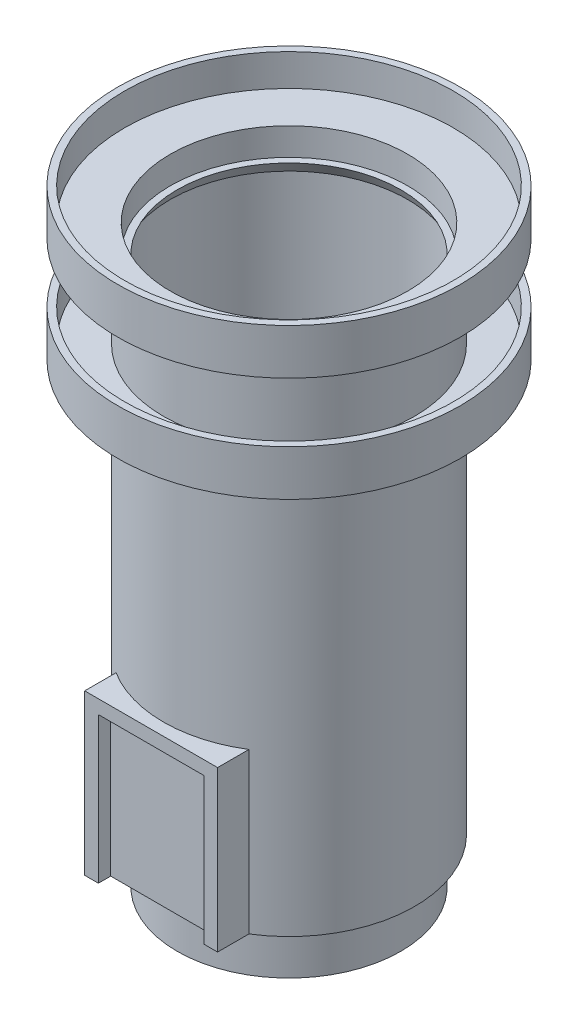
ISO-10303-21;
HEADER;
FILE_DESCRIPTION(('STEP AP214'),'2;1');
FILE_NAME('part.step','',(''),(''),'','','');
FILE_SCHEMA(('AUTOMOTIVE_DESIGN { 1 0 10303 214 1 1 1 1 }'));
ENDSEC;
DATA;
#1=APPLICATION_CONTEXT('core data for automotive mechanical design processes');
#2=APPLICATION_PROTOCOL_DEFINITION('international standard','automotive_design',2000,#1);
#3=PRODUCT_CONTEXT('',#1,'mechanical');
#4=PRODUCT('Part','Part','',(#3));
#5=PRODUCT_RELATED_PRODUCT_CATEGORY('part','',(#4));
#6=PRODUCT_DEFINITION_FORMATION('','',#4);
#7=PRODUCT_DEFINITION_CONTEXT('part definition',#1,'design');
#8=PRODUCT_DEFINITION('design','',#6,#7);
#9=PRODUCT_DEFINITION_SHAPE('','',#8);
#10=(LENGTH_UNIT() NAMED_UNIT(*) SI_UNIT(.MILLI.,.METRE.));
#11=(NAMED_UNIT(*) PLANE_ANGLE_UNIT() SI_UNIT($,.RADIAN.));
#12=(NAMED_UNIT(*) SI_UNIT($,.STERADIAN.) SOLID_ANGLE_UNIT());
#13=UNCERTAINTY_MEASURE_WITH_UNIT(LENGTH_MEASURE(1.E-05),#10,'distance_accuracy_value','');
#14=(GEOMETRIC_REPRESENTATION_CONTEXT(3) GLOBAL_UNCERTAINTY_ASSIGNED_CONTEXT((#13)) GLOBAL_UNIT_ASSIGNED_CONTEXT((#10,
#11,#12)) REPRESENTATION_CONTEXT('',''));
#15=CARTESIAN_POINT('',(0.,0.,0.));
#16=DIRECTION('',(0.,0.,1.));
#17=DIRECTION('',(1.,0.,0.));
#18=AXIS2_PLACEMENT_3D('',#15,#16,#17);
#19=CARTESIAN_POINT('',(-40.7129955139234,3.51989743721269,0.));
#20=DIRECTION('',(0.,-1.,0.));
#21=DIRECTION('',(1.,0.,0.));
#22=AXIS2_PLACEMENT_3D('',#19,#20,#21);
#23=PLANE('',#22);
#24=CARTESIAN_POINT('',(-17.7129955139234,3.51989743721269,0.));
#25=DIRECTION('',(0.,1.,0.));
#26=DIRECTION('',(-1.,0.,0.));
#27=AXIS2_PLACEMENT_3D('',#24,#25,#26);
#28=CIRCLE('',#27,23.);
#29=CARTESIAN_POINT('',(-40.7129955139234,3.51989743721269,0.));
#30=VERTEX_POINT('',#29);
#31=EDGE_CURVE('E158',#30,#30,#28,.T.);
#32=ORIENTED_EDGE('',*,*,#31,.T.);
#33=EDGE_LOOP('',(#32));
#34=FACE_BOUND('',#33,.T.);
#35=CARTESIAN_POINT('',(-17.7129955139234,3.51989743721269,0.));
#36=DIRECTION('',(0.,1.,0.));
#37=DIRECTION('',(-1.,0.,0.));
#38=AXIS2_PLACEMENT_3D('',#35,#36,#37);
#39=CIRCLE('',#38,24.5);
#40=CARTESIAN_POINT('',(-42.2129955139234,3.51989743721269,0.));
#41=VERTEX_POINT('',#40);
#42=EDGE_CURVE('E11',#41,#41,#39,.T.);
#43=ORIENTED_EDGE('',*,*,#42,.F.);
#44=EDGE_LOOP('',(#43));
#45=FACE_BOUND('',#44,.T.);
#46=ADVANCED_FACE('F33',(#34,#45),#23,.T.);
#47=CARTESIAN_POINT('',(-17.7129955139234,104.262295081967,0.));
#48=DIRECTION('',(0.,1.,0.));
#49=DIRECTION('',(-1.,0.,0.));
#50=AXIS2_PLACEMENT_3D('',#47,#48,#49);
#51=CYLINDRICAL_SURFACE('',#50,24.5);
#52=ORIENTED_EDGE('',*,*,#42,.T.);
#53=EDGE_LOOP('',(#52));
#54=FACE_BOUND('',#53,.T.);
#55=CARTESIAN_POINT('',(-17.7129955139234,13.5198974372127,0.));
#56=DIRECTION('',(0.,1.,0.));
#57=DIRECTION('',(-1.,0.,0.));
#58=AXIS2_PLACEMENT_3D('',#55,#56,#57);
#59=CIRCLE('',#58,24.5);
#60=CARTESIAN_POINT('',(-42.2129955139234,13.5198974372127,0.));
#61=VERTEX_POINT('',#60);
#62=EDGE_CURVE('E40',#61,#61,#59,.T.);
#63=ORIENTED_EDGE('',*,*,#62,.F.);
#64=EDGE_LOOP('',(#63));
#65=FACE_BOUND('',#64,.T.);
#66=ADVANCED_FACE('F223',(#54,#65),#51,.T.);
#67=CARTESIAN_POINT('',(-42.2129955139234,13.5198974372127,0.));
#68=DIRECTION('',(0.,-1.,0.));
#69=DIRECTION('',(1.,0.,0.));
#70=AXIS2_PLACEMENT_3D('',#67,#68,#69);
#71=PLANE('',#70);
#72=DIRECTION('',(0.,0.,1.));
#73=VECTOR('',#72,1.);
#74=CARTESIAN_POINT('',(-29.267838598035,13.5198974372127,27.502521141036));
#75=LINE('',#74,#73);
#76=CARTESIAN_POINT('',(-29.267838598035,13.5198974372127,27.502521141036));
#77=VERTEX_POINT('',#76);
#78=CARTESIAN_POINT('',(-29.267838598035,13.5198974372127,30.202521141036));
#79=VERTEX_POINT('',#78);
#80=EDGE_CURVE('E98',#77,#79,#75,.T.);
#81=ORIENTED_EDGE('',*,*,#80,.T.);
#82=DIRECTION('',(-1.,0.,0.));
#83=VECTOR('',#82,1.);
#84=CARTESIAN_POINT('',(-32.267838598035,13.5198974372127,30.202521141036));
#85=LINE('',#84,#83);
#86=CARTESIAN_POINT('',(-32.267838598035,13.5198974372127,30.202521141036));
#87=VERTEX_POINT('',#86);
#88=EDGE_CURVE('E152',#79,#87,#85,.T.);
#89=ORIENTED_EDGE('',*,*,#88,.T.);
#90=DIRECTION('',(0.,0.,-1.));
#91=VECTOR('',#90,1.);
#92=CARTESIAN_POINT('',(-32.267838598035,13.5198974372127,23.332521141036));
#93=LINE('',#92,#91);
#94=CARTESIAN_POINT('',(-32.267838598035,13.5198974372127,23.332521141036));
#95=VERTEX_POINT('',#94);
#96=EDGE_CURVE('E140',#87,#95,#93,.T.);
#97=ORIENTED_EDGE('',*,*,#96,.T.);
#98=CARTESIAN_POINT('',(-17.7129955139234,13.5198974372127,0.));
#99=DIRECTION('',(0.,1.,0.));
#100=DIRECTION('',(-1.,0.,0.));
#101=AXIS2_PLACEMENT_3D('',#98,#99,#100);
#102=CIRCLE('',#101,27.5000000000001);
#103=CARTESIAN_POINT('',(-3.15815242981178,13.5198974372127,23.332521141036));
#104=VERTEX_POINT('',#103);
#105=EDGE_CURVE('E219',#104,#95,#102,.T.);
#106=ORIENTED_EDGE('',*,*,#105,.F.);
#107=DIRECTION('',(0.,0.,1.));
#108=VECTOR('',#107,1.);
#109=CARTESIAN_POINT('',(-3.15815242981178,13.5198974372127,23.332521141036));
#110=LINE('',#109,#108);
#111=CARTESIAN_POINT('',(-3.15815242981178,13.5198974372127,30.202521141036));
#112=VERTEX_POINT('',#111);
#113=EDGE_CURVE('E133',#104,#112,#110,.T.);
#114=ORIENTED_EDGE('',*,*,#113,.T.);
#115=CARTESIAN_POINT('',(-6.15815242981178,13.5198974372127,30.202521141036));
#116=VERTEX_POINT('',#115);
#117=EDGE_CURVE('E153',#112,#116,#85,.T.);
#118=ORIENTED_EDGE('',*,*,#117,.T.);
#119=DIRECTION('',(0.,0.,1.));
#120=VECTOR('',#119,1.);
#121=CARTESIAN_POINT('',(-6.15815242981178,13.5198974372127,27.502521141036));
#122=LINE('',#121,#120);
#123=CARTESIAN_POINT('',(-6.15815242981178,13.5198974372127,27.502521141036));
#124=VERTEX_POINT('',#123);
#125=EDGE_CURVE('E47',#124,#116,#122,.T.);
#126=ORIENTED_EDGE('',*,*,#125,.F.);
#127=DIRECTION('',(1.,0.,0.));
#128=VECTOR('',#127,1.);
#129=CARTESIAN_POINT('',(-29.267838598035,13.5198974372127,27.502521141036));
#130=LINE('',#129,#128);
#131=EDGE_CURVE('E114',#77,#124,#130,.T.);
#132=ORIENTED_EDGE('',*,*,#131,.F.);
#133=EDGE_LOOP('',(#81,#89,#97,#106,#114,#118,#126,#132));
#134=FACE_BOUND('',#133,.T.);
#135=ORIENTED_EDGE('',*,*,#62,.T.);
#136=EDGE_LOOP('',(#135));
#137=FACE_BOUND('',#136,.T.);
#138=ADVANCED_FACE('F118',(#134,#137),#71,.T.);
#139=CARTESIAN_POINT('',(-17.7129955139234,104.262295081967,0.));
#140=DIRECTION('',(0.,1.,0.));
#141=DIRECTION('',(-1.,0.,0.));
#142=AXIS2_PLACEMENT_3D('',#139,#140,#141);
#143=CYLINDRICAL_SURFACE('',#142,27.5000000000001);
#144=DIRECTION('',(0.,-1.,0.));
#145=VECTOR('',#144,1.);
#146=CARTESIAN_POINT('',(-32.267838598035,48.5198974372127,23.332521141036));
#147=LINE('',#146,#145);
#148=CARTESIAN_POINT('',(-32.267838598035,48.5198974372127,23.332521141036));
#149=VERTEX_POINT('',#148);
#150=EDGE_CURVE('E55',#149,#95,#147,.T.);
#151=ORIENTED_EDGE('',*,*,#150,.F.);
#152=CARTESIAN_POINT('',(-17.7129955139234,48.5198974372127,0.));
#153=DIRECTION('',(0.,1.,0.));
#154=DIRECTION('',(-1.,0.,0.));
#155=AXIS2_PLACEMENT_3D('',#152,#153,#154);
#156=CIRCLE('',#155,27.5);
#157=CARTESIAN_POINT('',(-3.15815242981179,48.5198974372127,23.332521141036));
#158=VERTEX_POINT('',#157);
#159=EDGE_CURVE('E137',#149,#158,#156,.T.);
#160=ORIENTED_EDGE('',*,*,#159,.T.);
#161=DIRECTION('',(0.,-1.,0.));
#162=VECTOR('',#161,1.);
#163=CARTESIAN_POINT('',(-3.15815242981179,48.5198974372127,23.332521141036));
#164=LINE('',#163,#162);
#165=EDGE_CURVE('E149',#158,#104,#164,.T.);
#166=ORIENTED_EDGE('',*,*,#165,.T.);
#167=ORIENTED_EDGE('',*,*,#105,.T.);
#168=EDGE_LOOP('',(#151,#160,#166,#167));
#169=FACE_BOUND('',#168,.T.);
#170=CARTESIAN_POINT('',(-17.7129955139234,100.519897437213,0.));
#171=DIRECTION('',(0.,1.,0.));
#172=DIRECTION('',(-1.,0.,0.));
#173=AXIS2_PLACEMENT_3D('',#170,#171,#172);
#174=CIRCLE('',#173,27.5000000000001);
#175=CARTESIAN_POINT('',(-45.2129955139235,100.519897437213,0.));
#176=VERTEX_POINT('',#175);
#177=EDGE_CURVE('E216',#176,#176,#174,.T.);
#178=ORIENTED_EDGE('',*,*,#177,.F.);
#179=EDGE_LOOP('',(#178));
#180=FACE_BOUND('',#179,.T.);
#181=ADVANCED_FACE('F230',(#169,#180),#143,.T.);
#182=CARTESIAN_POINT('',(-17.7129955139234,103.519897437213,0.));
#183=DIRECTION('',(0.,1.,0.));
#184=DIRECTION('',(-1.,0.,0.));
#185=AXIS2_PLACEMENT_3D('',#182,#183,#184);
#186=CONICAL_SURFACE('',#185,37.5000000000001,1.27933953231703);
#187=ORIENTED_EDGE('',*,*,#177,.T.);
#188=EDGE_LOOP('',(#187));
#189=FACE_BOUND('',#188,.T.);
#190=CARTESIAN_POINT('',(-17.7129955139234,103.519897437213,0.));
#191=DIRECTION('',(0.,1.,0.));
#192=DIRECTION('',(-1.,0.,0.));
#193=AXIS2_PLACEMENT_3D('',#190,#191,#192);
#194=CIRCLE('',#193,37.5000000000001);
#195=CARTESIAN_POINT('',(-55.2129955139235,103.519897437213,0.));
#196=VERTEX_POINT('',#195);
#197=EDGE_CURVE('E213',#196,#196,#194,.T.);
#198=ORIENTED_EDGE('',*,*,#197,.F.);
#199=EDGE_LOOP('',(#198));
#200=FACE_BOUND('',#199,.T.);
#201=ADVANCED_FACE('F236',(#189,#200),#186,.T.);
#202=CARTESIAN_POINT('',(-17.7129955139234,104.262295081967,0.));
#203=DIRECTION('',(0.,1.,0.));
#204=DIRECTION('',(-1.,0.,0.));
#205=AXIS2_PLACEMENT_3D('',#202,#203,#204);
#206=CYLINDRICAL_SURFACE('',#205,37.5000000000001);
#207=ORIENTED_EDGE('',*,*,#197,.T.);
#208=EDGE_LOOP('',(#207));
#209=FACE_BOUND('',#208,.T.);
#210=CARTESIAN_POINT('',(-17.7129955139234,113.519897437213,0.));
#211=DIRECTION('',(0.,1.,0.));
#212=DIRECTION('',(-1.,0.,0.));
#213=AXIS2_PLACEMENT_3D('',#210,#211,#212);
#214=CIRCLE('',#213,37.5000000000001);
#215=CARTESIAN_POINT('',(-55.2129955139235,113.519897437213,0.));
#216=VERTEX_POINT('',#215);
#217=EDGE_CURVE('E210',#216,#216,#214,.T.);
#218=ORIENTED_EDGE('',*,*,#217,.F.);
#219=EDGE_LOOP('',(#218));
#220=FACE_BOUND('',#219,.T.);
#221=ADVANCED_FACE('F239',(#209,#220),#206,.T.);
#222=CARTESIAN_POINT('',(-55.2129955139235,113.519897437213,0.));
#223=DIRECTION('',(0.,1.,0.));
#224=DIRECTION('',(-1.,0.,0.));
#225=AXIS2_PLACEMENT_3D('',#222,#223,#224);
#226=PLANE('',#225);
#227=ORIENTED_EDGE('',*,*,#217,.T.);
#228=EDGE_LOOP('',(#227));
#229=FACE_BOUND('',#228,.T.);
#230=CARTESIAN_POINT('',(-17.7129955139234,113.519897437213,0.));
#231=DIRECTION('',(0.,1.,0.));
#232=DIRECTION('',(-1.,0.,0.));
#233=AXIS2_PLACEMENT_3D('',#230,#231,#232);
#234=CIRCLE('',#233,36.0000000000001);
#235=CARTESIAN_POINT('',(-53.7129955139235,113.519897437213,0.));
#236=VERTEX_POINT('',#235);
#237=EDGE_CURVE('E207',#236,#236,#234,.T.);
#238=ORIENTED_EDGE('',*,*,#237,.F.);
#239=EDGE_LOOP('',(#238));
#240=FACE_BOUND('',#239,.T.);
#241=ADVANCED_FACE('F243',(#229,#240),#226,.T.);
#242=CARTESIAN_POINT('',(-17.7129955139234,104.262295081967,0.));
#243=DIRECTION('',(0.,1.,0.));
#244=DIRECTION('',(-1.,0.,0.));
#245=AXIS2_PLACEMENT_3D('',#242,#243,#244);
#246=CYLINDRICAL_SURFACE('',#245,36.0000000000001);
#247=ORIENTED_EDGE('',*,*,#237,.T.);
#248=EDGE_LOOP('',(#247));
#249=FACE_BOUND('',#248,.T.);
#250=CARTESIAN_POINT('',(-17.7129955139234,106.519897437213,0.));
#251=DIRECTION('',(0.,1.,0.));
#252=DIRECTION('',(-1.,0.,0.));
#253=AXIS2_PLACEMENT_3D('',#250,#251,#252);
#254=CIRCLE('',#253,36.0000000000001);
#255=CARTESIAN_POINT('',(-53.7129955139235,106.519897437213,0.));
#256=VERTEX_POINT('',#255);
#257=EDGE_CURVE('E204',#256,#256,#254,.T.);
#258=ORIENTED_EDGE('',*,*,#257,.F.);
#259=EDGE_LOOP('',(#258));
#260=FACE_BOUND('',#259,.T.);
#261=ADVANCED_FACE('F247',(#249,#260),#246,.F.);
#262=CARTESIAN_POINT('',(-53.7129955139235,106.519897437213,0.));
#263=DIRECTION('',(0.,1.,0.));
#264=DIRECTION('',(-1.,0.,0.));
#265=AXIS2_PLACEMENT_3D('',#262,#263,#264);
#266=PLANE('',#265);
#267=ORIENTED_EDGE('',*,*,#257,.T.);
#268=EDGE_LOOP('',(#267));
#269=FACE_BOUND('',#268,.T.);
#270=CARTESIAN_POINT('',(-17.7129955139234,106.519897437213,0.));
#271=DIRECTION('',(0.,1.,0.));
#272=DIRECTION('',(-1.,0.,0.));
#273=AXIS2_PLACEMENT_3D('',#270,#271,#272);
#274=CIRCLE('',#273,27.5000000000001);
#275=CARTESIAN_POINT('',(-45.2129955139235,106.519897437213,0.));
#276=VERTEX_POINT('',#275);
#277=EDGE_CURVE('E201',#276,#276,#274,.T.);
#278=ORIENTED_EDGE('',*,*,#277,.F.);
#279=EDGE_LOOP('',(#278));
#280=FACE_BOUND('',#279,.T.);
#281=ADVANCED_FACE('F251',(#269,#280),#266,.T.);
#282=CARTESIAN_POINT('',(-17.7129955139234,104.262295081967,0.));
#283=DIRECTION('',(0.,1.,0.));
#284=DIRECTION('',(-1.,0.,0.));
#285=AXIS2_PLACEMENT_3D('',#282,#283,#284);
#286=CYLINDRICAL_SURFACE('',#285,27.5000000000001);
#287=ORIENTED_EDGE('',*,*,#277,.T.);
#288=EDGE_LOOP('',(#287));
#289=FACE_BOUND('',#288,.T.);
#290=CARTESIAN_POINT('',(-17.7129955139234,123.519897437213,0.));
#291=DIRECTION('',(0.,1.,0.));
#292=DIRECTION('',(-1.,0.,0.));
#293=AXIS2_PLACEMENT_3D('',#290,#291,#292);
#294=CIRCLE('',#293,27.5000000000001);
#295=CARTESIAN_POINT('',(-45.2129955139235,123.519897437213,0.));
#296=VERTEX_POINT('',#295);
#297=EDGE_CURVE('E198',#296,#296,#294,.T.);
#298=ORIENTED_EDGE('',*,*,#297,.F.);
#299=EDGE_LOOP('',(#298));
#300=FACE_BOUND('',#299,.T.);
#301=ADVANCED_FACE('F255',(#289,#300),#286,.T.);
#302=CARTESIAN_POINT('',(-17.7129955139234,126.519897437213,0.));
#303=DIRECTION('',(0.,1.,0.));
#304=DIRECTION('',(-1.,0.,0.));
#305=AXIS2_PLACEMENT_3D('',#302,#303,#304);
#306=CONICAL_SURFACE('',#305,37.5000000000001,1.27933953231703);
#307=ORIENTED_EDGE('',*,*,#297,.T.);
#308=EDGE_LOOP('',(#307));
#309=FACE_BOUND('',#308,.T.);
#310=CARTESIAN_POINT('',(-17.7129955139234,126.519897437213,0.));
#311=DIRECTION('',(0.,1.,0.));
#312=DIRECTION('',(-1.,0.,0.));
#313=AXIS2_PLACEMENT_3D('',#310,#311,#312);
#314=CIRCLE('',#313,37.5000000000001);
#315=CARTESIAN_POINT('',(-55.2129955139235,126.519897437213,0.));
#316=VERTEX_POINT('',#315);
#317=EDGE_CURVE('E195',#316,#316,#314,.T.);
#318=ORIENTED_EDGE('',*,*,#317,.F.);
#319=EDGE_LOOP('',(#318));
#320=FACE_BOUND('',#319,.T.);
#321=ADVANCED_FACE('F259',(#309,#320),#306,.T.);
#322=CARTESIAN_POINT('',(-17.7129955139234,104.262295081967,0.));
#323=DIRECTION('',(0.,1.,0.));
#324=DIRECTION('',(-1.,0.,0.));
#325=AXIS2_PLACEMENT_3D('',#322,#323,#324);
#326=CYLINDRICAL_SURFACE('',#325,37.5000000000001);
#327=ORIENTED_EDGE('',*,*,#317,.T.);
#328=EDGE_LOOP('',(#327));
#329=FACE_BOUND('',#328,.T.);
#330=CARTESIAN_POINT('',(-17.7129955139234,136.519897437213,0.));
#331=DIRECTION('',(0.,1.,0.));
#332=DIRECTION('',(-1.,0.,0.));
#333=AXIS2_PLACEMENT_3D('',#330,#331,#332);
#334=CIRCLE('',#333,37.5000000000001);
#335=CARTESIAN_POINT('',(-55.2129955139235,136.519897437213,0.));
#336=VERTEX_POINT('',#335);
#337=EDGE_CURVE('E192',#336,#336,#334,.T.);
#338=ORIENTED_EDGE('',*,*,#337,.F.);
#339=EDGE_LOOP('',(#338));
#340=FACE_BOUND('',#339,.T.);
#341=ADVANCED_FACE('F263',(#329,#340),#326,.T.);
#342=CARTESIAN_POINT('',(-55.2129955139235,136.519897437213,0.));
#343=DIRECTION('',(0.,1.,0.));
#344=DIRECTION('',(-1.,0.,0.));
#345=AXIS2_PLACEMENT_3D('',#342,#343,#344);
#346=PLANE('',#345);
#347=ORIENTED_EDGE('',*,*,#337,.T.);
#348=EDGE_LOOP('',(#347));
#349=FACE_BOUND('',#348,.T.);
#350=CARTESIAN_POINT('',(-17.7129955139234,136.519897437213,0.));
#351=DIRECTION('',(0.,1.,0.));
#352=DIRECTION('',(-1.,0.,0.));
#353=AXIS2_PLACEMENT_3D('',#350,#351,#352);
#354=CIRCLE('',#353,36.);
#355=CARTESIAN_POINT('',(-53.7129955139235,136.519897437213,0.));
#356=VERTEX_POINT('',#355);
#357=EDGE_CURVE('E189',#356,#356,#354,.T.);
#358=ORIENTED_EDGE('',*,*,#357,.F.);
#359=EDGE_LOOP('',(#358));
#360=FACE_BOUND('',#359,.T.);
#361=ADVANCED_FACE('F267',(#349,#360),#346,.T.);
#362=CARTESIAN_POINT('',(-17.7129955139234,104.262295081967,0.));
#363=DIRECTION('',(0.,1.,0.));
#364=DIRECTION('',(-1.,0.,0.));
#365=AXIS2_PLACEMENT_3D('',#362,#363,#364);
#366=CYLINDRICAL_SURFACE('',#365,36.0000000000001);
#367=ORIENTED_EDGE('',*,*,#357,.T.);
#368=EDGE_LOOP('',(#367));
#369=FACE_BOUND('',#368,.T.);
#370=CARTESIAN_POINT('',(-17.7129955139234,129.519897437213,0.));
#371=DIRECTION('',(0.,1.,0.));
#372=DIRECTION('',(-1.,0.,0.));
#373=AXIS2_PLACEMENT_3D('',#370,#371,#372);
#374=CIRCLE('',#373,36.0000000000001);
#375=CARTESIAN_POINT('',(-53.7129955139235,129.519897437213,0.));
#376=VERTEX_POINT('',#375);
#377=EDGE_CURVE('E186',#376,#376,#374,.T.);
#378=ORIENTED_EDGE('',*,*,#377,.F.);
#379=EDGE_LOOP('',(#378));
#380=FACE_BOUND('',#379,.T.);
#381=ADVANCED_FACE('F271',(#369,#380),#366,.F.);
#382=CARTESIAN_POINT('',(-53.7129955139235,129.519897437213,0.));
#383=DIRECTION('',(0.,1.,0.));
#384=DIRECTION('',(-1.,0.,0.));
#385=AXIS2_PLACEMENT_3D('',#382,#383,#384);
#386=PLANE('',#385);
#387=ORIENTED_EDGE('',*,*,#377,.T.);
#388=EDGE_LOOP('',(#387));
#389=FACE_BOUND('',#388,.T.);
#390=CARTESIAN_POINT('',(-17.7129955139234,129.519897437213,0.));
#391=DIRECTION('',(0.,1.,0.));
#392=DIRECTION('',(-1.,0.,0.));
#393=AXIS2_PLACEMENT_3D('',#390,#391,#392);
#394=CIRCLE('',#393,26.);
#395=CARTESIAN_POINT('',(-43.7129955139235,129.519897437213,0.));
#396=VERTEX_POINT('',#395);
#397=EDGE_CURVE('E183',#396,#396,#394,.T.);
#398=ORIENTED_EDGE('',*,*,#397,.F.);
#399=EDGE_LOOP('',(#398));
#400=FACE_BOUND('',#399,.T.);
#401=ADVANCED_FACE('F275',(#389,#400),#386,.T.);
#402=CARTESIAN_POINT('',(-17.7129955139234,104.262295081967,0.));
#403=DIRECTION('',(0.,1.,0.));
#404=DIRECTION('',(-1.,0.,0.));
#405=AXIS2_PLACEMENT_3D('',#402,#403,#404);
#406=CYLINDRICAL_SURFACE('',#405,26.);
#407=ORIENTED_EDGE('',*,*,#397,.T.);
#408=EDGE_LOOP('',(#407));
#409=FACE_BOUND('',#408,.T.);
#410=CARTESIAN_POINT('',(-17.7129955139234,123.519897437213,0.));
#411=DIRECTION('',(0.,1.,0.));
#412=DIRECTION('',(-1.,0.,0.));
#413=AXIS2_PLACEMENT_3D('',#410,#411,#412);
#414=CIRCLE('',#413,26.);
#415=CARTESIAN_POINT('',(-43.7129955139235,123.519897437213,0.));
#416=VERTEX_POINT('',#415);
#417=EDGE_CURVE('E180',#416,#416,#414,.T.);
#418=ORIENTED_EDGE('',*,*,#417,.F.);
#419=EDGE_LOOP('',(#418));
#420=FACE_BOUND('',#419,.T.);
#421=ADVANCED_FACE('F279',(#409,#420),#406,.F.);
#422=CARTESIAN_POINT('',(-43.7129955139235,123.519897437213,0.));
#423=DIRECTION('',(0.,1.,0.));
#424=DIRECTION('',(-1.,0.,0.));
#425=AXIS2_PLACEMENT_3D('',#422,#423,#424);
#426=PLANE('',#425);
#427=ORIENTED_EDGE('',*,*,#417,.T.);
#428=EDGE_LOOP('',(#427));
#429=FACE_BOUND('',#428,.T.);
#430=CARTESIAN_POINT('',(-17.7129955139234,123.519897437213,0.));
#431=DIRECTION('',(0.,1.,0.));
#432=DIRECTION('',(-1.,0.,0.));
#433=AXIS2_PLACEMENT_3D('',#430,#431,#432);
#434=CIRCLE('',#433,24.5);
#435=CARTESIAN_POINT('',(-42.2129955139234,123.519897437213,0.));
#436=VERTEX_POINT('',#435);
#437=EDGE_CURVE('E177',#436,#436,#434,.T.);
#438=ORIENTED_EDGE('',*,*,#437,.F.);
#439=EDGE_LOOP('',(#438));
#440=FACE_BOUND('',#439,.T.);
#441=ADVANCED_FACE('F283',(#429,#440),#426,.T.);
#442=CARTESIAN_POINT('',(-17.7129955139234,120.917625561823,0.));
#443=DIRECTION('',(0.,-1.,0.));
#444=DIRECTION('',(1.,0.,0.));
#445=AXIS2_PLACEMENT_3D('',#442,#443,#444);
#446=CONICAL_SURFACE('',#445,26.0000000000001,0.522900344301376);
#447=ORIENTED_EDGE('',*,*,#437,.T.);
#448=EDGE_LOOP('',(#447));
#449=FACE_BOUND('',#448,.T.);
#450=CARTESIAN_POINT('',(-17.7129955139234,120.917625561823,0.));
#451=DIRECTION('',(0.,1.,0.));
#452=DIRECTION('',(-1.,0.,0.));
#453=AXIS2_PLACEMENT_3D('',#450,#451,#452);
#454=CIRCLE('',#453,26.0000000000001);
#455=CARTESIAN_POINT('',(-43.7129955139235,120.917625561823,0.));
#456=VERTEX_POINT('',#455);
#457=EDGE_CURVE('E174',#456,#456,#454,.T.);
#458=ORIENTED_EDGE('',*,*,#457,.F.);
#459=EDGE_LOOP('',(#458));
#460=FACE_BOUND('',#459,.T.);
#461=ADVANCED_FACE('F287',(#449,#460),#446,.F.);
#462=CARTESIAN_POINT('',(-17.7129955139234,104.262295081967,0.));
#463=DIRECTION('',(0.,1.,0.));
#464=DIRECTION('',(-1.,0.,0.));
#465=AXIS2_PLACEMENT_3D('',#462,#463,#464);
#466=CYLINDRICAL_SURFACE('',#465,26.0000000000001);
#467=ORIENTED_EDGE('',*,*,#457,.T.);
#468=EDGE_LOOP('',(#467));
#469=FACE_BOUND('',#468,.T.);
#470=CARTESIAN_POINT('',(-17.7129955139234,16.5198974372127,0.));
#471=DIRECTION('',(0.,1.,0.));
#472=DIRECTION('',(-1.,0.,0.));
#473=AXIS2_PLACEMENT_3D('',#470,#471,#472);
#474=CIRCLE('',#473,26.0000000000001);
#475=CARTESIAN_POINT('',(-43.7129955139235,16.5198974372127,0.));
#476=VERTEX_POINT('',#475);
#477=EDGE_CURVE('E171',#476,#476,#474,.T.);
#478=ORIENTED_EDGE('',*,*,#477,.F.);
#479=EDGE_LOOP('',(#478));
#480=FACE_BOUND('',#479,.T.);
#481=ADVANCED_FACE('F291',(#469,#480),#466,.F.);
#482=CARTESIAN_POINT('',(-40.7129955139234,16.5198974372127,0.));
#483=DIRECTION('',(0.,1.,0.));
#484=DIRECTION('',(-1.,0.,0.));
#485=AXIS2_PLACEMENT_3D('',#482,#483,#484);
#486=PLANE('',#485);
#487=ORIENTED_EDGE('',*,*,#477,.T.);
#488=EDGE_LOOP('',(#487));
#489=FACE_BOUND('',#488,.T.);
#490=CARTESIAN_POINT('',(-17.7129955139234,16.5198974372127,0.));
#491=DIRECTION('',(0.,1.,0.));
#492=DIRECTION('',(-1.,0.,0.));
#493=AXIS2_PLACEMENT_3D('',#490,#491,#492);
#494=CIRCLE('',#493,23.);
#495=CARTESIAN_POINT('',(-40.7129955139234,16.5198974372127,0.));
#496=VERTEX_POINT('',#495);
#497=EDGE_CURVE('E168',#496,#496,#494,.T.);
#498=ORIENTED_EDGE('',*,*,#497,.F.);
#499=EDGE_LOOP('',(#498));
#500=FACE_BOUND('',#499,.T.);
#501=ADVANCED_FACE('F295',(#489,#500),#486,.T.);
#502=CARTESIAN_POINT('',(-17.7129955139234,104.262295081967,0.));
#503=DIRECTION('',(0.,1.,0.));
#504=DIRECTION('',(-1.,0.,0.));
#505=AXIS2_PLACEMENT_3D('',#502,#503,#504);
#506=CYLINDRICAL_SURFACE('',#505,23.);
#507=ORIENTED_EDGE('',*,*,#497,.T.);
#508=EDGE_LOOP('',(#507));
#509=FACE_BOUND('',#508,.T.);
#510=ORIENTED_EDGE('',*,*,#31,.F.);
#511=EDGE_LOOP('',(#510));
#512=FACE_BOUND('',#511,.T.);
#513=ADVANCED_FACE('F299',(#509,#512),#506,.F.);
#514=CARTESIAN_POINT('',(-32.267838598035,48.5198974372127,23.332521141036));
#515=DIRECTION('',(-1.,0.,0.));
#516=DIRECTION('',(0.,-1.,0.));
#517=AXIS2_PLACEMENT_3D('',#514,#515,#516);
#518=PLANE('',#517);
#519=ORIENTED_EDGE('',*,*,#96,.F.);
#520=DIRECTION('',(0.,-1.,0.));
#521=VECTOR('',#520,1.);
#522=CARTESIAN_POINT('',(-32.267838598035,48.5198974372127,30.202521141036));
#523=LINE('',#522,#521);
#524=CARTESIAN_POINT('',(-32.267838598035,48.5198974372127,30.202521141036));
#525=VERTEX_POINT('',#524);
#526=EDGE_CURVE('E159',#525,#87,#523,.T.);
#527=ORIENTED_EDGE('',*,*,#526,.F.);
#528=DIRECTION('',(0.,0.,-1.));
#529=VECTOR('',#528,1.);
#530=CARTESIAN_POINT('',(-32.267838598035,48.5198974372127,23.332521141036));
#531=LINE('',#530,#529);
#532=EDGE_CURVE('E146',#525,#149,#531,.T.);
#533=ORIENTED_EDGE('',*,*,#532,.T.);
#534=ORIENTED_EDGE('',*,*,#150,.T.);
#535=EDGE_LOOP('',(#519,#527,#533,#534));
#536=FACE_BOUND('',#535,.T.);
#537=ADVANCED_FACE('F303',(#536),#518,.T.);
#538=CARTESIAN_POINT('',(-32.267838598035,48.5198974372127,30.202521141036));
#539=DIRECTION('',(0.,0.,1.));
#540=DIRECTION('',(1.,0.,0.));
#541=AXIS2_PLACEMENT_3D('',#538,#539,#540);
#542=PLANE('',#541);
#543=DIRECTION('',(0.,-1.,0.));
#544=VECTOR('',#543,1.);
#545=CARTESIAN_POINT('',(-29.267838598035,13.5198974372127,30.202521141036));
#546=LINE('',#545,#544);
#547=CARTESIAN_POINT('',(-29.267838598035,45.5198974372127,30.202521141036));
#548=VERTEX_POINT('',#547);
#549=EDGE_CURVE('E104',#548,#79,#546,.T.);
#550=ORIENTED_EDGE('',*,*,#549,.F.);
#551=DIRECTION('',(-1.,0.,0.));
#552=VECTOR('',#551,1.);
#553=CARTESIAN_POINT('',(-29.267838598035,45.5198974372127,30.202521141036));
#554=LINE('',#553,#552);
#555=CARTESIAN_POINT('',(-6.15815242981178,45.5198974372127,30.202521141036));
#556=VERTEX_POINT('',#555);
#557=EDGE_CURVE('E116',#556,#548,#554,.T.);
#558=ORIENTED_EDGE('',*,*,#557,.F.);
#559=DIRECTION('',(0.,1.,0.));
#560=VECTOR('',#559,1.);
#561=CARTESIAN_POINT('',(-6.15815242981178,13.5198974372127,30.202521141036));
#562=LINE('',#561,#560);
#563=EDGE_CURVE('E127',#116,#556,#562,.T.);
#564=ORIENTED_EDGE('',*,*,#563,.F.);
#565=ORIENTED_EDGE('',*,*,#117,.F.);
#566=DIRECTION('',(0.,-1.,0.));
#567=VECTOR('',#566,1.);
#568=CARTESIAN_POINT('',(-3.15815242981178,48.5198974372127,30.202521141036));
#569=LINE('',#568,#567);
#570=CARTESIAN_POINT('',(-3.15815242981178,48.5198974372127,30.202521141036));
#571=VERTEX_POINT('',#570);
#572=EDGE_CURVE('E162',#571,#112,#569,.T.);
#573=ORIENTED_EDGE('',*,*,#572,.F.);
#574=DIRECTION('',(-1.,0.,0.));
#575=VECTOR('',#574,1.);
#576=CARTESIAN_POINT('',(-32.267838598035,48.5198974372127,30.202521141036));
#577=LINE('',#576,#575);
#578=EDGE_CURVE('E143',#571,#525,#577,.T.);
#579=ORIENTED_EDGE('',*,*,#578,.T.);
#580=ORIENTED_EDGE('',*,*,#526,.T.);
#581=ORIENTED_EDGE('',*,*,#88,.F.);
#582=EDGE_LOOP('',(#550,#558,#564,#565,#573,#579,#580,#581));
#583=FACE_BOUND('',#582,.T.);
#584=ADVANCED_FACE('F309',(#583),#542,.T.);
#585=CARTESIAN_POINT('',(-3.15815242981179,48.5198974372127,23.332521141036));
#586=DIRECTION('',(1.,0.,0.));
#587=DIRECTION('',(0.,0.,-1.));
#588=AXIS2_PLACEMENT_3D('',#585,#586,#587);
#589=PLANE('',#588);
#590=ORIENTED_EDGE('',*,*,#113,.F.);
#591=ORIENTED_EDGE('',*,*,#165,.F.);
#592=DIRECTION('',(0.,0.,1.));
#593=VECTOR('',#592,1.);
#594=CARTESIAN_POINT('',(-3.15815242981179,48.5198974372127,23.332521141036));
#595=LINE('',#594,#593);
#596=EDGE_CURVE('E139',#158,#571,#595,.T.);
#597=ORIENTED_EDGE('',*,*,#596,.T.);
#598=ORIENTED_EDGE('',*,*,#572,.T.);
#599=EDGE_LOOP('',(#590,#591,#597,#598));
#600=FACE_BOUND('',#599,.T.);
#601=ADVANCED_FACE('F305',(#600),#589,.T.);
#602=CARTESIAN_POINT('',(-17.7129955139234,48.5198974372127,0.));
#603=DIRECTION('',(0.,1.,0.));
#604=DIRECTION('',(-1.,0.,0.));
#605=AXIS2_PLACEMENT_3D('',#602,#603,#604);
#606=PLANE('',#605);
#607=ORIENTED_EDGE('',*,*,#159,.F.);
#608=ORIENTED_EDGE('',*,*,#532,.F.);
#609=ORIENTED_EDGE('',*,*,#578,.F.);
#610=ORIENTED_EDGE('',*,*,#596,.F.);
#611=EDGE_LOOP('',(#607,#608,#609,#610));
#612=FACE_BOUND('',#611,.T.);
#613=ADVANCED_FACE('F308',(#612),#606,.T.);
#614=CARTESIAN_POINT('',(-29.267838598035,13.5198974372127,27.502521141036));
#615=DIRECTION('',(-1.,0.,0.));
#616=DIRECTION('',(0.,0.,1.));
#617=AXIS2_PLACEMENT_3D('',#614,#615,#616);
#618=PLANE('',#617);
#619=ORIENTED_EDGE('',*,*,#549,.T.);
#620=ORIENTED_EDGE('',*,*,#80,.F.);
#621=DIRECTION('',(0.,-1.,0.));
#622=VECTOR('',#621,1.);
#623=CARTESIAN_POINT('',(-29.267838598035,13.5198974372127,27.502521141036));
#624=LINE('',#623,#622);
#625=CARTESIAN_POINT('',(-29.267838598035,45.5198974372127,27.502521141036));
#626=VERTEX_POINT('',#625);
#627=EDGE_CURVE('E101',#626,#77,#624,.T.);
#628=ORIENTED_EDGE('',*,*,#627,.F.);
#629=DIRECTION('',(0.,0.,1.));
#630=VECTOR('',#629,1.);
#631=CARTESIAN_POINT('',(-29.267838598035,45.5198974372127,27.502521141036));
#632=LINE('',#631,#630);
#633=EDGE_CURVE('E131',#626,#548,#632,.T.);
#634=ORIENTED_EDGE('',*,*,#633,.T.);
#635=EDGE_LOOP('',(#619,#620,#628,#634));
#636=FACE_BOUND('',#635,.T.);
#637=ADVANCED_FACE('F100',(#636),#618,.F.);
#638=CARTESIAN_POINT('',(-29.267838598035,45.5198974372127,27.502521141036));
#639=DIRECTION('',(0.,1.,0.));
#640=DIRECTION('',(0.,0.,1.));
#641=AXIS2_PLACEMENT_3D('',#638,#639,#640);
#642=PLANE('',#641);
#643=ORIENTED_EDGE('',*,*,#557,.T.);
#644=ORIENTED_EDGE('',*,*,#633,.F.);
#645=DIRECTION('',(-1.,0.,0.));
#646=VECTOR('',#645,1.);
#647=CARTESIAN_POINT('',(-29.267838598035,45.5198974372127,27.502521141036));
#648=LINE('',#647,#646);
#649=CARTESIAN_POINT('',(-6.15815242981178,45.5198974372127,27.502521141036));
#650=VERTEX_POINT('',#649);
#651=EDGE_CURVE('E108',#650,#626,#648,.T.);
#652=ORIENTED_EDGE('',*,*,#651,.F.);
#653=DIRECTION('',(0.,0.,1.));
#654=VECTOR('',#653,1.);
#655=CARTESIAN_POINT('',(-6.15815242981178,45.5198974372127,27.502521141036));
#656=LINE('',#655,#654);
#657=EDGE_CURVE('E134',#650,#556,#656,.T.);
#658=ORIENTED_EDGE('',*,*,#657,.T.);
#659=EDGE_LOOP('',(#643,#644,#652,#658));
#660=FACE_BOUND('',#659,.T.);
#661=ADVANCED_FACE('F322',(#660),#642,.F.);
#662=CARTESIAN_POINT('',(-6.15815242981178,13.5198974372127,27.502521141036));
#663=DIRECTION('',(1.,0.,0.));
#664=DIRECTION('',(0.,0.,-1.));
#665=AXIS2_PLACEMENT_3D('',#662,#663,#664);
#666=PLANE('',#665);
#667=ORIENTED_EDGE('',*,*,#563,.T.);
#668=ORIENTED_EDGE('',*,*,#657,.F.);
#669=DIRECTION('',(0.,1.,0.));
#670=VECTOR('',#669,1.);
#671=CARTESIAN_POINT('',(-6.15815242981178,13.5198974372127,27.502521141036));
#672=LINE('',#671,#670);
#673=EDGE_CURVE('E121',#124,#650,#672,.T.);
#674=ORIENTED_EDGE('',*,*,#673,.F.);
#675=ORIENTED_EDGE('',*,*,#125,.T.);
#676=EDGE_LOOP('',(#667,#668,#674,#675));
#677=FACE_BOUND('',#676,.T.);
#678=ADVANCED_FACE('F323',(#677),#666,.F.);
#679=CARTESIAN_POINT('',(0.,0.,27.502521141036));
#680=DIRECTION('',(0.,0.,-1.));
#681=DIRECTION('',(-1.,0.,0.));
#682=AXIS2_PLACEMENT_3D('',#679,#680,#681);
#683=PLANE('',#682);
#684=ORIENTED_EDGE('',*,*,#627,.T.);
#685=ORIENTED_EDGE('',*,*,#131,.T.);
#686=ORIENTED_EDGE('',*,*,#673,.T.);
#687=ORIENTED_EDGE('',*,*,#651,.T.);
#688=EDGE_LOOP('',(#684,#685,#686,#687));
#689=FACE_BOUND('',#688,.T.);
#690=ADVANCED_FACE('F112',(#689),#683,.F.);
#691=CLOSED_SHELL('',(#46,#66,#138,#181,#201,#221,#241,#261,#281,#301,#321,#341,#361,#381,#401,
#421,#441,#461,#481,#501,#513,#537,#584,#601,#613,#637,#661,#678,#690));
#692=MANIFOLD_SOLID_BREP('B2',#691);
#693=ADVANCED_BREP_SHAPE_REPRESENTATION('',(#18,#692),#14);
#694=SHAPE_DEFINITION_REPRESENTATION(#9,#693);
ENDSEC;
END-ISO-10303-21;
